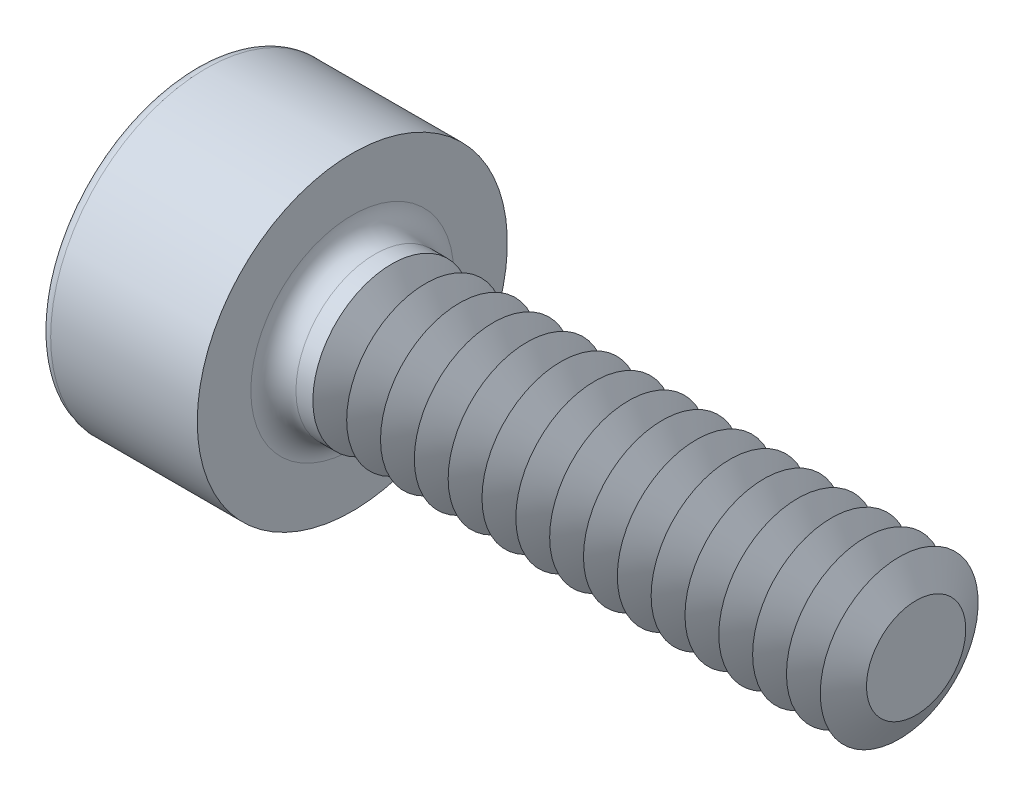
ISO-10303-21;
HEADER;
FILE_DESCRIPTION(('STEP AP214'),'2;1');
FILE_NAME('part.step','',(''),(''),'','','');
FILE_SCHEMA(('AUTOMOTIVE_DESIGN { 1 0 10303 214 1 1 1 1 }'));
ENDSEC;
DATA;
#1=APPLICATION_CONTEXT('core data for automotive mechanical design processes');
#2=APPLICATION_PROTOCOL_DEFINITION('international standard','automotive_design',2000,#1);
#3=PRODUCT_CONTEXT('',#1,'mechanical');
#4=PRODUCT('Part','Part','',(#3));
#5=PRODUCT_RELATED_PRODUCT_CATEGORY('part','',(#4));
#6=PRODUCT_DEFINITION_FORMATION('','',#4);
#7=PRODUCT_DEFINITION_CONTEXT('part definition',#1,'design');
#8=PRODUCT_DEFINITION('design','',#6,#7);
#9=PRODUCT_DEFINITION_SHAPE('','',#8);
#10=(LENGTH_UNIT() NAMED_UNIT(*) SI_UNIT(.MILLI.,.METRE.));
#11=(NAMED_UNIT(*) PLANE_ANGLE_UNIT() SI_UNIT($,.RADIAN.));
#12=(NAMED_UNIT(*) SI_UNIT($,.STERADIAN.) SOLID_ANGLE_UNIT());
#13=UNCERTAINTY_MEASURE_WITH_UNIT(LENGTH_MEASURE(1.E-05),#10,'distance_accuracy_value','');
#14=(GEOMETRIC_REPRESENTATION_CONTEXT(3) GLOBAL_UNCERTAINTY_ASSIGNED_CONTEXT((#13)) GLOBAL_UNIT_ASSIGNED_CONTEXT((#10,
#11,#12)) REPRESENTATION_CONTEXT('',''));
#15=CARTESIAN_POINT('',(0.,0.,0.));
#16=DIRECTION('',(0.,0.,1.));
#17=DIRECTION('',(1.,0.,0.));
#18=AXIS2_PLACEMENT_3D('',#15,#16,#17);
#19=CARTESIAN_POINT('',(5.35000440006454,0.,0.));
#20=DIRECTION('',(-1.,0.,0.));
#21=DIRECTION('',(0.,0.,1.));
#22=AXIS2_PLACEMENT_3D('',#19,#20,#21);
#23=CONICAL_SURFACE('',#22,0.7,1.04719755119659);
#24=CARTESIAN_POINT('',(5.5,0.,0.));
#25=DIRECTION('',(-1.,0.,0.));
#26=DIRECTION('',(0.,0.,1.));
#27=AXIS2_PLACEMENT_3D('',#24,#25,#26);
#28=CIRCLE('',#27,0.4402);
#29=CARTESIAN_POINT('',(5.5,0.,0.4402));
#30=VERTEX_POINT('',#29);
#31=EDGE_CURVE('E345',#30,#30,#28,.T.);
#32=ORIENTED_EDGE('',*,*,#31,.T.);
#33=EDGE_LOOP('',(#32));
#34=FACE_BOUND('',#33,.T.);
#35=CARTESIAN_POINT('',(5.34999559993547,0.,0.));
#36=DIRECTION('',(-1.,0.,0.));
#37=DIRECTION('',(0.,0.,1.));
#38=AXIS2_PLACEMENT_3D('',#35,#36,#37);
#39=CIRCLE('',#38,0.7);
#40=CARTESIAN_POINT('',(5.34999559993547,0.,0.7));
#41=VERTEX_POINT('',#40);
#42=EDGE_CURVE('E353',#41,#41,#39,.T.);
#43=ORIENTED_EDGE('',*,*,#42,.F.);
#44=EDGE_LOOP('',(#43));
#45=FACE_BOUND('',#44,.T.);
#46=ADVANCED_FACE('F41',(#34,#45),#23,.T.);
#47=CARTESIAN_POINT('',(5.5,0.,0.));
#48=DIRECTION('',(1.,0.,0.));
#49=DIRECTION('',(0.,0.,-1.));
#50=AXIS2_PLACEMENT_3D('',#47,#48,#49);
#51=CONICAL_SURFACE('',#50,0.4402,1.0471975511966);
#52=CARTESIAN_POINT('',(5.64999559993547,0.,0.));
#53=DIRECTION('',(-1.,0.,0.));
#54=DIRECTION('',(0.,0.,1.));
#55=AXIS2_PLACEMENT_3D('',#52,#53,#54);
#56=CIRCLE('',#55,0.7);
#57=CARTESIAN_POINT('',(5.64999559993547,0.,0.7));
#58=VERTEX_POINT('',#57);
#59=EDGE_CURVE('E347',#58,#58,#56,.T.);
#60=ORIENTED_EDGE('',*,*,#59,.T.);
#61=EDGE_LOOP('',(#60));
#62=FACE_BOUND('',#61,.T.);
#63=ORIENTED_EDGE('',*,*,#31,.F.);
#64=EDGE_LOOP('',(#63));
#65=FACE_BOUND('',#64,.T.);
#66=ADVANCED_FACE('F149',(#62,#65),#51,.T.);
#67=CARTESIAN_POINT('',(6.4,0.7,0.));
#68=DIRECTION('',(-1.,0.,0.));
#69=DIRECTION('',(0.,0.,1.));
#70=AXIS2_PLACEMENT_3D('',#67,#68,#69);
#71=PLANE('',#70);
#72=CARTESIAN_POINT('',(6.4,0.,0.));
#73=DIRECTION('',(-1.,0.,0.));
#74=DIRECTION('',(0.,0.,1.));
#75=AXIS2_PLACEMENT_3D('',#72,#73,#74);
#76=CIRCLE('',#75,0.4402);
#77=CARTESIAN_POINT('',(6.4,0.,0.4402));
#78=VERTEX_POINT('',#77);
#79=EDGE_CURVE('E274',#78,#78,#76,.T.);
#80=ORIENTED_EDGE('',*,*,#79,.F.);
#81=EDGE_LOOP('',(#80));
#82=FACE_BOUND('',#81,.T.);
#83=ADVANCED_FACE('F155',(#82),#71,.F.);
#84=CARTESIAN_POINT('',(6.25000440006454,0.,0.));
#85=DIRECTION('',(-1.,0.,0.));
#86=DIRECTION('',(0.,0.,1.));
#87=AXIS2_PLACEMENT_3D('',#84,#85,#86);
#88=CONICAL_SURFACE('',#87,0.7,1.04719755119659);
#89=ORIENTED_EDGE('',*,*,#79,.T.);
#90=EDGE_LOOP('',(#89));
#91=FACE_BOUND('',#90,.T.);
#92=CARTESIAN_POINT('',(6.24999559993547,0.,0.));
#93=DIRECTION('',(-1.,0.,0.));
#94=DIRECTION('',(0.,0.,1.));
#95=AXIS2_PLACEMENT_3D('',#92,#93,#94);
#96=CIRCLE('',#95,0.7);
#97=CARTESIAN_POINT('',(6.24999559993547,0.,0.7));
#98=VERTEX_POINT('',#97);
#99=EDGE_CURVE('E285',#98,#98,#96,.T.);
#100=ORIENTED_EDGE('',*,*,#99,.F.);
#101=EDGE_LOOP('',(#100));
#102=FACE_BOUND('',#101,.T.);
#103=ADVANCED_FACE('F175',(#91,#102),#88,.T.);
#104=CARTESIAN_POINT('',(6.1,0.,0.));
#105=DIRECTION('',(1.,0.,0.));
#106=DIRECTION('',(0.,0.,-1.));
#107=AXIS2_PLACEMENT_3D('',#104,#105,#106);
#108=CONICAL_SURFACE('',#107,0.4402,1.0471975511966);
#109=ORIENTED_EDGE('',*,*,#99,.T.);
#110=EDGE_LOOP('',(#109));
#111=FACE_BOUND('',#110,.T.);
#112=CARTESIAN_POINT('',(6.1,0.,0.));
#113=DIRECTION('',(-1.,0.,0.));
#114=DIRECTION('',(0.,0.,1.));
#115=AXIS2_PLACEMENT_3D('',#112,#113,#114);
#116=CIRCLE('',#115,0.4402);
#117=CARTESIAN_POINT('',(6.1,0.,0.4402));
#118=VERTEX_POINT('',#117);
#119=EDGE_CURVE('E278',#118,#118,#116,.T.);
#120=ORIENTED_EDGE('',*,*,#119,.F.);
#121=EDGE_LOOP('',(#120));
#122=FACE_BOUND('',#121,.T.);
#123=ADVANCED_FACE('F172',(#111,#122),#108,.T.);
#124=CARTESIAN_POINT('',(5.95000440006454,0.,0.));
#125=DIRECTION('',(-1.,0.,0.));
#126=DIRECTION('',(0.,0.,1.));
#127=AXIS2_PLACEMENT_3D('',#124,#125,#126);
#128=CONICAL_SURFACE('',#127,0.7,1.04719755119659);
#129=ORIENTED_EDGE('',*,*,#119,.T.);
#130=EDGE_LOOP('',(#129));
#131=FACE_BOUND('',#130,.T.);
#132=CARTESIAN_POINT('',(5.94999559993547,0.,0.));
#133=DIRECTION('',(-1.,0.,0.));
#134=DIRECTION('',(0.,0.,1.));
#135=AXIS2_PLACEMENT_3D('',#132,#133,#134);
#136=CIRCLE('',#135,0.7);
#137=CARTESIAN_POINT('',(5.94999559993547,0.,0.7));
#138=VERTEX_POINT('',#137);
#139=EDGE_CURVE('E342',#138,#138,#136,.T.);
#140=ORIENTED_EDGE('',*,*,#139,.F.);
#141=EDGE_LOOP('',(#140));
#142=FACE_BOUND('',#141,.T.);
#143=ADVANCED_FACE('F166',(#131,#142),#128,.T.);
#144=CARTESIAN_POINT('',(5.8,0.,0.));
#145=DIRECTION('',(1.,0.,0.));
#146=DIRECTION('',(0.,0.,-1.));
#147=AXIS2_PLACEMENT_3D('',#144,#145,#146);
#148=CONICAL_SURFACE('',#147,0.4402,1.0471975511966);
#149=ORIENTED_EDGE('',*,*,#139,.T.);
#150=EDGE_LOOP('',(#149));
#151=FACE_BOUND('',#150,.T.);
#152=CARTESIAN_POINT('',(5.8,0.,0.));
#153=DIRECTION('',(-1.,0.,0.));
#154=DIRECTION('',(0.,0.,1.));
#155=AXIS2_PLACEMENT_3D('',#152,#153,#154);
#156=CIRCLE('',#155,0.4402);
#157=CARTESIAN_POINT('',(5.8,0.,0.4402));
#158=VERTEX_POINT('',#157);
#159=EDGE_CURVE('E339',#158,#158,#156,.T.);
#160=ORIENTED_EDGE('',*,*,#159,.F.);
#161=EDGE_LOOP('',(#160));
#162=FACE_BOUND('',#161,.T.);
#163=ADVANCED_FACE('F162',(#151,#162),#148,.T.);
#164=CARTESIAN_POINT('',(5.65000440006454,0.,0.));
#165=DIRECTION('',(-1.,0.,0.));
#166=DIRECTION('',(0.,0.,1.));
#167=AXIS2_PLACEMENT_3D('',#164,#165,#166);
#168=CONICAL_SURFACE('',#167,0.7,1.04719755119659);
#169=ORIENTED_EDGE('',*,*,#159,.T.);
#170=EDGE_LOOP('',(#169));
#171=FACE_BOUND('',#170,.T.);
#172=ORIENTED_EDGE('',*,*,#59,.F.);
#173=EDGE_LOOP('',(#172));
#174=FACE_BOUND('',#173,.T.);
#175=ADVANCED_FACE('F165',(#171,#174),#168,.T.);
#176=CARTESIAN_POINT('',(5.05000440006454,0.,0.));
#177=DIRECTION('',(-1.,0.,0.));
#178=DIRECTION('',(0.,0.,1.));
#179=AXIS2_PLACEMENT_3D('',#176,#177,#178);
#180=CONICAL_SURFACE('',#179,0.7,1.04719755119659);
#181=CARTESIAN_POINT('',(5.2,0.,0.));
#182=DIRECTION('',(-1.,0.,0.));
#183=DIRECTION('',(0.,0.,1.));
#184=AXIS2_PLACEMENT_3D('',#181,#182,#183);
#185=CIRCLE('',#184,0.4402);
#186=CARTESIAN_POINT('',(5.2,0.,0.4402));
#187=VERTEX_POINT('',#186);
#188=EDGE_CURVE('E350',#187,#187,#185,.T.);
#189=ORIENTED_EDGE('',*,*,#188,.T.);
#190=EDGE_LOOP('',(#189));
#191=FACE_BOUND('',#190,.T.);
#192=CARTESIAN_POINT('',(5.04999559993547,0.,0.));
#193=DIRECTION('',(-1.,0.,0.));
#194=DIRECTION('',(0.,0.,1.));
#195=AXIS2_PLACEMENT_3D('',#192,#193,#194);
#196=CIRCLE('',#195,0.7);
#197=CARTESIAN_POINT('',(5.04999559993547,0.,0.7));
#198=VERTEX_POINT('',#197);
#199=EDGE_CURVE('E359',#198,#198,#196,.T.);
#200=ORIENTED_EDGE('',*,*,#199,.F.);
#201=EDGE_LOOP('',(#200));
#202=FACE_BOUND('',#201,.T.);
#203=ADVANCED_FACE('F170',(#191,#202),#180,.T.);
#204=CARTESIAN_POINT('',(5.2,0.,0.));
#205=DIRECTION('',(1.,0.,0.));
#206=DIRECTION('',(0.,0.,-1.));
#207=AXIS2_PLACEMENT_3D('',#204,#205,#206);
#208=CONICAL_SURFACE('',#207,0.4402,1.0471975511966);
#209=ORIENTED_EDGE('',*,*,#42,.T.);
#210=EDGE_LOOP('',(#209));
#211=FACE_BOUND('',#210,.T.);
#212=ORIENTED_EDGE('',*,*,#188,.F.);
#213=EDGE_LOOP('',(#212));
#214=FACE_BOUND('',#213,.T.);
#215=ADVANCED_FACE('F516',(#211,#214),#208,.T.);
#216=CARTESIAN_POINT('',(4.75000440006454,0.,0.));
#217=DIRECTION('',(-1.,0.,0.));
#218=DIRECTION('',(0.,0.,1.));
#219=AXIS2_PLACEMENT_3D('',#216,#217,#218);
#220=CONICAL_SURFACE('',#219,0.7,1.04719755119659);
#221=CARTESIAN_POINT('',(4.9,0.,0.));
#222=DIRECTION('',(-1.,0.,0.));
#223=DIRECTION('',(0.,0.,1.));
#224=AXIS2_PLACEMENT_3D('',#221,#222,#223);
#225=CIRCLE('',#224,0.4402);
#226=CARTESIAN_POINT('',(4.9,0.,0.4402));
#227=VERTEX_POINT('',#226);
#228=EDGE_CURVE('E356',#227,#227,#225,.T.);
#229=ORIENTED_EDGE('',*,*,#228,.T.);
#230=EDGE_LOOP('',(#229));
#231=FACE_BOUND('',#230,.T.);
#232=CARTESIAN_POINT('',(4.74999559993547,0.,0.));
#233=DIRECTION('',(-1.,0.,0.));
#234=DIRECTION('',(0.,0.,1.));
#235=AXIS2_PLACEMENT_3D('',#232,#233,#234);
#236=CIRCLE('',#235,0.7);
#237=CARTESIAN_POINT('',(4.74999559993547,0.,0.7));
#238=VERTEX_POINT('',#237);
#239=EDGE_CURVE('E365',#238,#238,#236,.T.);
#240=ORIENTED_EDGE('',*,*,#239,.F.);
#241=EDGE_LOOP('',(#240));
#242=FACE_BOUND('',#241,.T.);
#243=ADVANCED_FACE('F512',(#231,#242),#220,.T.);
#244=CARTESIAN_POINT('',(4.9,0.,0.));
#245=DIRECTION('',(1.,0.,0.));
#246=DIRECTION('',(0.,0.,-1.));
#247=AXIS2_PLACEMENT_3D('',#244,#245,#246);
#248=CONICAL_SURFACE('',#247,0.4402,1.0471975511966);
#249=ORIENTED_EDGE('',*,*,#199,.T.);
#250=EDGE_LOOP('',(#249));
#251=FACE_BOUND('',#250,.T.);
#252=ORIENTED_EDGE('',*,*,#228,.F.);
#253=EDGE_LOOP('',(#252));
#254=FACE_BOUND('',#253,.T.);
#255=ADVANCED_FACE('F508',(#251,#254),#248,.T.);
#256=CARTESIAN_POINT('',(4.45000440006454,0.,0.));
#257=DIRECTION('',(-1.,0.,0.));
#258=DIRECTION('',(0.,0.,1.));
#259=AXIS2_PLACEMENT_3D('',#256,#257,#258);
#260=CONICAL_SURFACE('',#259,0.7,1.04719755119659);
#261=CARTESIAN_POINT('',(4.6,0.,0.));
#262=DIRECTION('',(-1.,0.,0.));
#263=DIRECTION('',(0.,0.,1.));
#264=AXIS2_PLACEMENT_3D('',#261,#262,#263);
#265=CIRCLE('',#264,0.4402);
#266=CARTESIAN_POINT('',(4.6,0.,0.4402));
#267=VERTEX_POINT('',#266);
#268=EDGE_CURVE('E362',#267,#267,#265,.T.);
#269=ORIENTED_EDGE('',*,*,#268,.T.);
#270=EDGE_LOOP('',(#269));
#271=FACE_BOUND('',#270,.T.);
#272=CARTESIAN_POINT('',(4.44999559993547,0.,0.));
#273=DIRECTION('',(-1.,0.,0.));
#274=DIRECTION('',(0.,0.,1.));
#275=AXIS2_PLACEMENT_3D('',#272,#273,#274);
#276=CIRCLE('',#275,0.7);
#277=CARTESIAN_POINT('',(4.44999559993547,0.,0.7));
#278=VERTEX_POINT('',#277);
#279=EDGE_CURVE('E371',#278,#278,#276,.T.);
#280=ORIENTED_EDGE('',*,*,#279,.F.);
#281=EDGE_LOOP('',(#280));
#282=FACE_BOUND('',#281,.T.);
#283=ADVANCED_FACE('F504',(#271,#282),#260,.T.);
#284=CARTESIAN_POINT('',(4.6,0.,0.));
#285=DIRECTION('',(1.,0.,0.));
#286=DIRECTION('',(0.,0.,-1.));
#287=AXIS2_PLACEMENT_3D('',#284,#285,#286);
#288=CONICAL_SURFACE('',#287,0.4402,1.0471975511966);
#289=ORIENTED_EDGE('',*,*,#239,.T.);
#290=EDGE_LOOP('',(#289));
#291=FACE_BOUND('',#290,.T.);
#292=ORIENTED_EDGE('',*,*,#268,.F.);
#293=EDGE_LOOP('',(#292));
#294=FACE_BOUND('',#293,.T.);
#295=ADVANCED_FACE('F500',(#291,#294),#288,.T.);
#296=CARTESIAN_POINT('',(4.15000440006454,0.,0.));
#297=DIRECTION('',(-1.,0.,0.));
#298=DIRECTION('',(0.,0.,1.));
#299=AXIS2_PLACEMENT_3D('',#296,#297,#298);
#300=CONICAL_SURFACE('',#299,0.7,1.04719755119659);
#301=CARTESIAN_POINT('',(4.3,0.,0.));
#302=DIRECTION('',(-1.,0.,0.));
#303=DIRECTION('',(0.,0.,1.));
#304=AXIS2_PLACEMENT_3D('',#301,#302,#303);
#305=CIRCLE('',#304,0.4402);
#306=CARTESIAN_POINT('',(4.3,0.,0.4402));
#307=VERTEX_POINT('',#306);
#308=EDGE_CURVE('E368',#307,#307,#305,.T.);
#309=ORIENTED_EDGE('',*,*,#308,.T.);
#310=EDGE_LOOP('',(#309));
#311=FACE_BOUND('',#310,.T.);
#312=CARTESIAN_POINT('',(4.14999559993547,0.,0.));
#313=DIRECTION('',(-1.,0.,0.));
#314=DIRECTION('',(0.,0.,1.));
#315=AXIS2_PLACEMENT_3D('',#312,#313,#314);
#316=CIRCLE('',#315,0.7);
#317=CARTESIAN_POINT('',(4.14999559993547,0.,0.7));
#318=VERTEX_POINT('',#317);
#319=EDGE_CURVE('E377',#318,#318,#316,.T.);
#320=ORIENTED_EDGE('',*,*,#319,.F.);
#321=EDGE_LOOP('',(#320));
#322=FACE_BOUND('',#321,.T.);
#323=ADVANCED_FACE('F496',(#311,#322),#300,.T.);
#324=CARTESIAN_POINT('',(4.3,0.,0.));
#325=DIRECTION('',(1.,0.,0.));
#326=DIRECTION('',(0.,0.,-1.));
#327=AXIS2_PLACEMENT_3D('',#324,#325,#326);
#328=CONICAL_SURFACE('',#327,0.4402,1.0471975511966);
#329=ORIENTED_EDGE('',*,*,#279,.T.);
#330=EDGE_LOOP('',(#329));
#331=FACE_BOUND('',#330,.T.);
#332=ORIENTED_EDGE('',*,*,#308,.F.);
#333=EDGE_LOOP('',(#332));
#334=FACE_BOUND('',#333,.T.);
#335=ADVANCED_FACE('F492',(#331,#334),#328,.T.);
#336=CARTESIAN_POINT('',(3.85000440006454,0.,0.));
#337=DIRECTION('',(-1.,0.,0.));
#338=DIRECTION('',(0.,0.,1.));
#339=AXIS2_PLACEMENT_3D('',#336,#337,#338);
#340=CONICAL_SURFACE('',#339,0.7,1.04719755119659);
#341=CARTESIAN_POINT('',(4.,0.,0.));
#342=DIRECTION('',(-1.,0.,0.));
#343=DIRECTION('',(0.,0.,1.));
#344=AXIS2_PLACEMENT_3D('',#341,#342,#343);
#345=CIRCLE('',#344,0.4402);
#346=CARTESIAN_POINT('',(4.,0.,0.4402));
#347=VERTEX_POINT('',#346);
#348=EDGE_CURVE('E374',#347,#347,#345,.T.);
#349=ORIENTED_EDGE('',*,*,#348,.T.);
#350=EDGE_LOOP('',(#349));
#351=FACE_BOUND('',#350,.T.);
#352=CARTESIAN_POINT('',(3.84999559993547,0.,0.));
#353=DIRECTION('',(-1.,0.,0.));
#354=DIRECTION('',(0.,0.,1.));
#355=AXIS2_PLACEMENT_3D('',#352,#353,#354);
#356=CIRCLE('',#355,0.7);
#357=CARTESIAN_POINT('',(3.84999559993547,0.,0.7));
#358=VERTEX_POINT('',#357);
#359=EDGE_CURVE('E383',#358,#358,#356,.T.);
#360=ORIENTED_EDGE('',*,*,#359,.F.);
#361=EDGE_LOOP('',(#360));
#362=FACE_BOUND('',#361,.T.);
#363=ADVANCED_FACE('F488',(#351,#362),#340,.T.);
#364=CARTESIAN_POINT('',(4.,0.,0.));
#365=DIRECTION('',(1.,0.,0.));
#366=DIRECTION('',(0.,0.,-1.));
#367=AXIS2_PLACEMENT_3D('',#364,#365,#366);
#368=CONICAL_SURFACE('',#367,0.4402,1.0471975511966);
#369=ORIENTED_EDGE('',*,*,#319,.T.);
#370=EDGE_LOOP('',(#369));
#371=FACE_BOUND('',#370,.T.);
#372=ORIENTED_EDGE('',*,*,#348,.F.);
#373=EDGE_LOOP('',(#372));
#374=FACE_BOUND('',#373,.T.);
#375=ADVANCED_FACE('F484',(#371,#374),#368,.T.);
#376=CARTESIAN_POINT('',(3.55000440006454,0.,0.));
#377=DIRECTION('',(-1.,0.,0.));
#378=DIRECTION('',(0.,0.,1.));
#379=AXIS2_PLACEMENT_3D('',#376,#377,#378);
#380=CONICAL_SURFACE('',#379,0.7,1.04719755119659);
#381=CARTESIAN_POINT('',(3.7,0.,0.));
#382=DIRECTION('',(-1.,0.,0.));
#383=DIRECTION('',(0.,0.,1.));
#384=AXIS2_PLACEMENT_3D('',#381,#382,#383);
#385=CIRCLE('',#384,0.4402);
#386=CARTESIAN_POINT('',(3.7,0.,0.4402));
#387=VERTEX_POINT('',#386);
#388=EDGE_CURVE('E380',#387,#387,#385,.T.);
#389=ORIENTED_EDGE('',*,*,#388,.T.);
#390=EDGE_LOOP('',(#389));
#391=FACE_BOUND('',#390,.T.);
#392=CARTESIAN_POINT('',(3.54999559993547,0.,0.));
#393=DIRECTION('',(-1.,0.,0.));
#394=DIRECTION('',(0.,0.,1.));
#395=AXIS2_PLACEMENT_3D('',#392,#393,#394);
#396=CIRCLE('',#395,0.7);
#397=CARTESIAN_POINT('',(3.54999559993547,0.,0.7));
#398=VERTEX_POINT('',#397);
#399=EDGE_CURVE('E389',#398,#398,#396,.T.);
#400=ORIENTED_EDGE('',*,*,#399,.F.);
#401=EDGE_LOOP('',(#400));
#402=FACE_BOUND('',#401,.T.);
#403=ADVANCED_FACE('F480',(#391,#402),#380,.T.);
#404=CARTESIAN_POINT('',(3.7,0.,0.));
#405=DIRECTION('',(1.,0.,0.));
#406=DIRECTION('',(0.,0.,-1.));
#407=AXIS2_PLACEMENT_3D('',#404,#405,#406);
#408=CONICAL_SURFACE('',#407,0.4402,1.0471975511966);
#409=ORIENTED_EDGE('',*,*,#359,.T.);
#410=EDGE_LOOP('',(#409));
#411=FACE_BOUND('',#410,.T.);
#412=ORIENTED_EDGE('',*,*,#388,.F.);
#413=EDGE_LOOP('',(#412));
#414=FACE_BOUND('',#413,.T.);
#415=ADVANCED_FACE('F476',(#411,#414),#408,.T.);
#416=CARTESIAN_POINT('',(3.25000440006454,0.,0.));
#417=DIRECTION('',(-1.,0.,0.));
#418=DIRECTION('',(0.,0.,1.));
#419=AXIS2_PLACEMENT_3D('',#416,#417,#418);
#420=CONICAL_SURFACE('',#419,0.7,1.04719755119659);
#421=CARTESIAN_POINT('',(3.4,0.,0.));
#422=DIRECTION('',(-1.,0.,0.));
#423=DIRECTION('',(0.,0.,1.));
#424=AXIS2_PLACEMENT_3D('',#421,#422,#423);
#425=CIRCLE('',#424,0.4402);
#426=CARTESIAN_POINT('',(3.4,0.,0.4402));
#427=VERTEX_POINT('',#426);
#428=EDGE_CURVE('E386',#427,#427,#425,.T.);
#429=ORIENTED_EDGE('',*,*,#428,.T.);
#430=EDGE_LOOP('',(#429));
#431=FACE_BOUND('',#430,.T.);
#432=CARTESIAN_POINT('',(3.24999559993547,0.,0.));
#433=DIRECTION('',(-1.,0.,0.));
#434=DIRECTION('',(0.,0.,1.));
#435=AXIS2_PLACEMENT_3D('',#432,#433,#434);
#436=CIRCLE('',#435,0.7);
#437=CARTESIAN_POINT('',(3.24999559993547,0.,0.7));
#438=VERTEX_POINT('',#437);
#439=EDGE_CURVE('E395',#438,#438,#436,.T.);
#440=ORIENTED_EDGE('',*,*,#439,.F.);
#441=EDGE_LOOP('',(#440));
#442=FACE_BOUND('',#441,.T.);
#443=ADVANCED_FACE('F472',(#431,#442),#420,.T.);
#444=CARTESIAN_POINT('',(3.4,0.,0.));
#445=DIRECTION('',(1.,0.,0.));
#446=DIRECTION('',(0.,0.,-1.));
#447=AXIS2_PLACEMENT_3D('',#444,#445,#446);
#448=CONICAL_SURFACE('',#447,0.4402,1.0471975511966);
#449=ORIENTED_EDGE('',*,*,#399,.T.);
#450=EDGE_LOOP('',(#449));
#451=FACE_BOUND('',#450,.T.);
#452=ORIENTED_EDGE('',*,*,#428,.F.);
#453=EDGE_LOOP('',(#452));
#454=FACE_BOUND('',#453,.T.);
#455=ADVANCED_FACE('F468',(#451,#454),#448,.T.);
#456=CARTESIAN_POINT('',(2.95000440006454,0.,0.));
#457=DIRECTION('',(-1.,0.,0.));
#458=DIRECTION('',(0.,0.,1.));
#459=AXIS2_PLACEMENT_3D('',#456,#457,#458);
#460=CONICAL_SURFACE('',#459,0.7,1.04719755119659);
#461=CARTESIAN_POINT('',(3.1,0.,0.));
#462=DIRECTION('',(-1.,0.,0.));
#463=DIRECTION('',(0.,0.,1.));
#464=AXIS2_PLACEMENT_3D('',#461,#462,#463);
#465=CIRCLE('',#464,0.4402);
#466=CARTESIAN_POINT('',(3.1,0.,0.4402));
#467=VERTEX_POINT('',#466);
#468=EDGE_CURVE('E392',#467,#467,#465,.T.);
#469=ORIENTED_EDGE('',*,*,#468,.T.);
#470=EDGE_LOOP('',(#469));
#471=FACE_BOUND('',#470,.T.);
#472=CARTESIAN_POINT('',(2.94999559993547,0.,0.));
#473=DIRECTION('',(-1.,0.,0.));
#474=DIRECTION('',(0.,0.,1.));
#475=AXIS2_PLACEMENT_3D('',#472,#473,#474);
#476=CIRCLE('',#475,0.7);
#477=CARTESIAN_POINT('',(2.94999559993547,0.,0.7));
#478=VERTEX_POINT('',#477);
#479=EDGE_CURVE('E401',#478,#478,#476,.T.);
#480=ORIENTED_EDGE('',*,*,#479,.F.);
#481=EDGE_LOOP('',(#480));
#482=FACE_BOUND('',#481,.T.);
#483=ADVANCED_FACE('F464',(#471,#482),#460,.T.);
#484=CARTESIAN_POINT('',(3.1,0.,0.));
#485=DIRECTION('',(1.,0.,0.));
#486=DIRECTION('',(0.,0.,-1.));
#487=AXIS2_PLACEMENT_3D('',#484,#485,#486);
#488=CONICAL_SURFACE('',#487,0.4402,1.0471975511966);
#489=ORIENTED_EDGE('',*,*,#439,.T.);
#490=EDGE_LOOP('',(#489));
#491=FACE_BOUND('',#490,.T.);
#492=ORIENTED_EDGE('',*,*,#468,.F.);
#493=EDGE_LOOP('',(#492));
#494=FACE_BOUND('',#493,.T.);
#495=ADVANCED_FACE('F460',(#491,#494),#488,.T.);
#496=CARTESIAN_POINT('',(2.65000440006454,0.,0.));
#497=DIRECTION('',(-1.,0.,0.));
#498=DIRECTION('',(0.,0.,1.));
#499=AXIS2_PLACEMENT_3D('',#496,#497,#498);
#500=CONICAL_SURFACE('',#499,0.7,1.04719755119659);
#501=CARTESIAN_POINT('',(2.8,0.,0.));
#502=DIRECTION('',(-1.,0.,0.));
#503=DIRECTION('',(0.,0.,1.));
#504=AXIS2_PLACEMENT_3D('',#501,#502,#503);
#505=CIRCLE('',#504,0.4402);
#506=CARTESIAN_POINT('',(2.8,0.,0.4402));
#507=VERTEX_POINT('',#506);
#508=EDGE_CURVE('E398',#507,#507,#505,.T.);
#509=ORIENTED_EDGE('',*,*,#508,.T.);
#510=EDGE_LOOP('',(#509));
#511=FACE_BOUND('',#510,.T.);
#512=CARTESIAN_POINT('',(2.64999559993547,0.,0.));
#513=DIRECTION('',(-1.,0.,0.));
#514=DIRECTION('',(0.,0.,1.));
#515=AXIS2_PLACEMENT_3D('',#512,#513,#514);
#516=CIRCLE('',#515,0.7);
#517=CARTESIAN_POINT('',(2.64999559993547,0.,0.7));
#518=VERTEX_POINT('',#517);
#519=EDGE_CURVE('E407',#518,#518,#516,.T.);
#520=ORIENTED_EDGE('',*,*,#519,.F.);
#521=EDGE_LOOP('',(#520));
#522=FACE_BOUND('',#521,.T.);
#523=ADVANCED_FACE('F456',(#511,#522),#500,.T.);
#524=CARTESIAN_POINT('',(2.8,0.,0.));
#525=DIRECTION('',(1.,0.,0.));
#526=DIRECTION('',(0.,0.,-1.));
#527=AXIS2_PLACEMENT_3D('',#524,#525,#526);
#528=CONICAL_SURFACE('',#527,0.4402,1.0471975511966);
#529=ORIENTED_EDGE('',*,*,#479,.T.);
#530=EDGE_LOOP('',(#529));
#531=FACE_BOUND('',#530,.T.);
#532=ORIENTED_EDGE('',*,*,#508,.F.);
#533=EDGE_LOOP('',(#532));
#534=FACE_BOUND('',#533,.T.);
#535=ADVANCED_FACE('F452',(#531,#534),#528,.T.);
#536=CARTESIAN_POINT('',(2.35000440006454,0.,0.));
#537=DIRECTION('',(-1.,0.,0.));
#538=DIRECTION('',(0.,0.,1.));
#539=AXIS2_PLACEMENT_3D('',#536,#537,#538);
#540=CONICAL_SURFACE('',#539,0.7,1.04719755119659);
#541=CARTESIAN_POINT('',(2.5,0.,0.));
#542=DIRECTION('',(-1.,0.,0.));
#543=DIRECTION('',(0.,0.,1.));
#544=AXIS2_PLACEMENT_3D('',#541,#542,#543);
#545=CIRCLE('',#544,0.4402);
#546=CARTESIAN_POINT('',(2.5,0.,0.4402));
#547=VERTEX_POINT('',#546);
#548=EDGE_CURVE('E404',#547,#547,#545,.T.);
#549=ORIENTED_EDGE('',*,*,#548,.T.);
#550=EDGE_LOOP('',(#549));
#551=FACE_BOUND('',#550,.T.);
#552=CARTESIAN_POINT('',(2.34999559993547,0.,0.));
#553=DIRECTION('',(-1.,0.,0.));
#554=DIRECTION('',(0.,0.,1.));
#555=AXIS2_PLACEMENT_3D('',#552,#553,#554);
#556=CIRCLE('',#555,0.7);
#557=CARTESIAN_POINT('',(2.34999559993547,0.,0.7));
#558=VERTEX_POINT('',#557);
#559=EDGE_CURVE('E413',#558,#558,#556,.T.);
#560=ORIENTED_EDGE('',*,*,#559,.F.);
#561=EDGE_LOOP('',(#560));
#562=FACE_BOUND('',#561,.T.);
#563=ADVANCED_FACE('F448',(#551,#562),#540,.T.);
#564=CARTESIAN_POINT('',(2.5,0.,0.));
#565=DIRECTION('',(1.,0.,0.));
#566=DIRECTION('',(0.,0.,-1.));
#567=AXIS2_PLACEMENT_3D('',#564,#565,#566);
#568=CONICAL_SURFACE('',#567,0.4402,1.0471975511966);
#569=ORIENTED_EDGE('',*,*,#519,.T.);
#570=EDGE_LOOP('',(#569));
#571=FACE_BOUND('',#570,.T.);
#572=ORIENTED_EDGE('',*,*,#548,.F.);
#573=EDGE_LOOP('',(#572));
#574=FACE_BOUND('',#573,.T.);
#575=ADVANCED_FACE('F444',(#571,#574),#568,.T.);
#576=CARTESIAN_POINT('',(2.05000440006454,0.,0.));
#577=DIRECTION('',(-1.,0.,0.));
#578=DIRECTION('',(0.,0.,1.));
#579=AXIS2_PLACEMENT_3D('',#576,#577,#578);
#580=CONICAL_SURFACE('',#579,0.7,1.04719755119659);
#581=CARTESIAN_POINT('',(2.2,0.,0.));
#582=DIRECTION('',(-1.,0.,0.));
#583=DIRECTION('',(0.,0.,1.));
#584=AXIS2_PLACEMENT_3D('',#581,#582,#583);
#585=CIRCLE('',#584,0.4402);
#586=CARTESIAN_POINT('',(2.2,0.,0.4402));
#587=VERTEX_POINT('',#586);
#588=EDGE_CURVE('E410',#587,#587,#585,.T.);
#589=ORIENTED_EDGE('',*,*,#588,.T.);
#590=EDGE_LOOP('',(#589));
#591=FACE_BOUND('',#590,.T.);
#592=CARTESIAN_POINT('',(2.04999559993547,0.,0.));
#593=DIRECTION('',(-1.,0.,0.));
#594=DIRECTION('',(0.,0.,1.));
#595=AXIS2_PLACEMENT_3D('',#592,#593,#594);
#596=CIRCLE('',#595,0.7);
#597=CARTESIAN_POINT('',(2.04999559993547,0.,0.7));
#598=VERTEX_POINT('',#597);
#599=EDGE_CURVE('E419',#598,#598,#596,.T.);
#600=ORIENTED_EDGE('',*,*,#599,.F.);
#601=EDGE_LOOP('',(#600));
#602=FACE_BOUND('',#601,.T.);
#603=ADVANCED_FACE('F438',(#591,#602),#580,.T.);
#604=CARTESIAN_POINT('',(2.2,0.,0.));
#605=DIRECTION('',(1.,0.,0.));
#606=DIRECTION('',(0.,0.,-1.));
#607=AXIS2_PLACEMENT_3D('',#604,#605,#606);
#608=CONICAL_SURFACE('',#607,0.4402,1.0471975511966);
#609=ORIENTED_EDGE('',*,*,#559,.T.);
#610=EDGE_LOOP('',(#609));
#611=FACE_BOUND('',#610,.T.);
#612=ORIENTED_EDGE('',*,*,#588,.F.);
#613=EDGE_LOOP('',(#612));
#614=FACE_BOUND('',#613,.T.);
#615=ADVANCED_FACE('F429',(#611,#614),#608,.T.);
#616=CARTESIAN_POINT('',(1.75000440006454,0.,0.));
#617=DIRECTION('',(-1.,0.,0.));
#618=DIRECTION('',(0.,0.,1.));
#619=AXIS2_PLACEMENT_3D('',#616,#617,#618);
#620=CONICAL_SURFACE('',#619,0.7,1.04719755119659);
#621=CARTESIAN_POINT('',(1.9,0.,0.));
#622=DIRECTION('',(-1.,0.,0.));
#623=DIRECTION('',(0.,0.,1.));
#624=AXIS2_PLACEMENT_3D('',#621,#622,#623);
#625=CIRCLE('',#624,0.4402);
#626=CARTESIAN_POINT('',(1.9,0.,0.4402));
#627=VERTEX_POINT('',#626);
#628=EDGE_CURVE('E416',#627,#627,#625,.T.);
#629=ORIENTED_EDGE('',*,*,#628,.T.);
#630=EDGE_LOOP('',(#629));
#631=FACE_BOUND('',#630,.T.);
#632=CARTESIAN_POINT('',(1.75000440006454,0.,0.));
#633=DIRECTION('',(-1.,0.,0.));
#634=DIRECTION('',(0.,0.,1.));
#635=AXIS2_PLACEMENT_3D('',#632,#633,#634);
#636=CIRCLE('',#635,0.7);
#637=CARTESIAN_POINT('',(1.75000440006454,0.,0.7));
#638=VERTEX_POINT('',#637);
#639=EDGE_CURVE('E422',#638,#638,#636,.T.);
#640=ORIENTED_EDGE('',*,*,#639,.F.);
#641=EDGE_LOOP('',(#640));
#642=FACE_BOUND('',#641,.T.);
#643=ADVANCED_FACE('F427',(#631,#642),#620,.T.);
#644=CARTESIAN_POINT('',(1.9,0.,0.));
#645=DIRECTION('',(1.,0.,0.));
#646=DIRECTION('',(0.,0.,-1.));
#647=AXIS2_PLACEMENT_3D('',#644,#645,#646);
#648=CONICAL_SURFACE('',#647,0.4402,1.0471975511966);
#649=ORIENTED_EDGE('',*,*,#599,.T.);
#650=EDGE_LOOP('',(#649));
#651=FACE_BOUND('',#650,.T.);
#652=ORIENTED_EDGE('',*,*,#628,.F.);
#653=EDGE_LOOP('',(#652));
#654=FACE_BOUND('',#653,.T.);
#655=ADVANCED_FACE('F198',(#651,#654),#648,.T.);
#656=CARTESIAN_POINT('',(0.7,0.749111974273539,-0.4325));
#657=DIRECTION('',(-0.898067507594914,-0.439857649475667,0.));
#658=DIRECTION('',(0.439857649475667,-0.898067507594914,0.));
#659=AXIS2_PLACEMENT_3D('',#656,#657,#658);
#660=PLANE('',#659);
#661=DIRECTION('',(-0.39048865355203,0.797269689995388,-0.460303870135567));
#662=VECTOR('',#661,1.);
#663=CARTESIAN_POINT('',(1.06690185249043,0.,0.));
#664=LINE('',#663,#662);
#665=CARTESIAN_POINT('',(1.06690185249043,0.,0.));
#666=VERTEX_POINT('',#665);
#667=CARTESIAN_POINT('',(0.7,0.749111974273539,-0.4325));
#668=VERTEX_POINT('',#667);
#669=EDGE_CURVE('E293',#666,#668,#664,.T.);
#670=ORIENTED_EDGE('',*,*,#669,.F.);
#671=DIRECTION('',(-0.39048865355203,0.797269689995388,0.460303870135567));
#672=VECTOR('',#671,1.);
#673=CARTESIAN_POINT('',(1.06690185249043,0.,0.));
#674=LINE('',#673,#672);
#675=CARTESIAN_POINT('',(0.7,0.749111974273539,0.4325));
#676=VERTEX_POINT('',#675);
#677=EDGE_CURVE('E282',#666,#676,#674,.T.);
#678=ORIENTED_EDGE('',*,*,#677,.T.);
#679=DIRECTION('',(0.,0.,-1.));
#680=VECTOR('',#679,1.);
#681=CARTESIAN_POINT('',(0.7,0.749111974273539,0.4325));
#682=LINE('',#681,#680);
#683=EDGE_CURVE('E303',#676,#668,#682,.T.);
#684=ORIENTED_EDGE('',*,*,#683,.T.);
#685=EDGE_LOOP('',(#670,#678,#684));
#686=FACE_BOUND('',#685,.T.);
#687=ADVANCED_FACE('F191',(#686),#660,.T.);
#688=CARTESIAN_POINT('',(0.7,0.,-0.865));
#689=DIRECTION('',(-0.898067507594914,-0.219928824737834,0.380927898494839));
#690=DIRECTION('',(0.39048865355203,0.,0.920607740271133));
#691=AXIS2_PLACEMENT_3D('',#688,#689,#690);
#692=PLANE('',#691);
#693=DIRECTION('',(-0.39048865355203,0.,-0.920607740271133));
#694=VECTOR('',#693,1.);
#695=CARTESIAN_POINT('',(1.06690185249043,0.,0.));
#696=LINE('',#695,#694);
#697=CARTESIAN_POINT('',(0.7,0.,-0.865));
#698=VERTEX_POINT('',#697);
#699=EDGE_CURVE('E289',#666,#698,#696,.T.);
#700=ORIENTED_EDGE('',*,*,#699,.F.);
#701=ORIENTED_EDGE('',*,*,#669,.T.);
#702=DIRECTION('',(0.,-0.866025403784439,-0.5));
#703=VECTOR('',#702,1.);
#704=CARTESIAN_POINT('',(0.7,0.749111974273539,-0.4325));
#705=LINE('',#704,#703);
#706=EDGE_CURVE('E306',#668,#698,#705,.T.);
#707=ORIENTED_EDGE('',*,*,#706,.T.);
#708=EDGE_LOOP('',(#700,#701,#707));
#709=FACE_BOUND('',#708,.T.);
#710=ADVANCED_FACE('F187',(#709),#692,.T.);
#711=CARTESIAN_POINT('',(0.7,-0.749111974273539,-0.4325));
#712=DIRECTION('',(-0.898067507594914,0.219928824737834,0.380927898494839));
#713=DIRECTION('',(0.39048865355203,0.,0.920607740271133));
#714=AXIS2_PLACEMENT_3D('',#711,#712,#713);
#715=PLANE('',#714);
#716=DIRECTION('',(-0.39048865355203,-0.797269689995388,-0.460303870135567));
#717=VECTOR('',#716,1.);
#718=CARTESIAN_POINT('',(1.06690185249043,0.,0.));
#719=LINE('',#718,#717);
#720=CARTESIAN_POINT('',(0.7,-0.749111974273539,-0.4325));
#721=VERTEX_POINT('',#720);
#722=EDGE_CURVE('E65',#666,#721,#719,.T.);
#723=ORIENTED_EDGE('',*,*,#722,.F.);
#724=ORIENTED_EDGE('',*,*,#699,.T.);
#725=DIRECTION('',(0.,-0.866025403784439,0.5));
#726=VECTOR('',#725,1.);
#727=CARTESIAN_POINT('',(0.7,0.,-0.865));
#728=LINE('',#727,#726);
#729=EDGE_CURVE('E309',#698,#721,#728,.T.);
#730=ORIENTED_EDGE('',*,*,#729,.T.);
#731=EDGE_LOOP('',(#723,#724,#730));
#732=FACE_BOUND('',#731,.T.);
#733=ADVANCED_FACE('F183',(#732),#715,.T.);
#734=CARTESIAN_POINT('',(0.7,-0.749111974273539,0.4325));
#735=DIRECTION('',(-0.898067507594914,0.439857649475667,0.));
#736=DIRECTION('',(-0.439857649475667,-0.898067507594914,0.));
#737=AXIS2_PLACEMENT_3D('',#734,#735,#736);
#738=PLANE('',#737);
#739=DIRECTION('',(-0.39048865355203,-0.797269689995388,0.460303870135567));
#740=VECTOR('',#739,1.);
#741=CARTESIAN_POINT('',(1.06690185249043,0.,0.));
#742=LINE('',#741,#740);
#743=CARTESIAN_POINT('',(0.7,-0.749111974273539,0.4325));
#744=VERTEX_POINT('',#743);
#745=EDGE_CURVE('E296',#666,#744,#742,.T.);
#746=ORIENTED_EDGE('',*,*,#745,.F.);
#747=ORIENTED_EDGE('',*,*,#722,.T.);
#748=DIRECTION('',(0.,0.,1.));
#749=VECTOR('',#748,1.);
#750=CARTESIAN_POINT('',(0.7,-0.749111974273539,-0.4325));
#751=LINE('',#750,#749);
#752=EDGE_CURVE('E93',#721,#744,#751,.T.);
#753=ORIENTED_EDGE('',*,*,#752,.T.);
#754=EDGE_LOOP('',(#746,#747,#753));
#755=FACE_BOUND('',#754,.T.);
#756=ADVANCED_FACE('F186',(#755),#738,.T.);
#757=CARTESIAN_POINT('',(0.7,0.,0.865));
#758=DIRECTION('',(-0.898067507594914,0.219928824737834,-0.380927898494839));
#759=DIRECTION('',(-0.39048865355203,0.,0.920607740271134));
#760=AXIS2_PLACEMENT_3D('',#757,#758,#759);
#761=PLANE('',#760);
#762=DIRECTION('',(-0.39048865355203,0.,0.920607740271133));
#763=VECTOR('',#762,1.);
#764=CARTESIAN_POINT('',(1.06690185249043,0.,0.));
#765=LINE('',#764,#763);
#766=CARTESIAN_POINT('',(0.7,0.,0.865));
#767=VERTEX_POINT('',#766);
#768=EDGE_CURVE('E277',#666,#767,#765,.T.);
#769=ORIENTED_EDGE('',*,*,#768,.F.);
#770=ORIENTED_EDGE('',*,*,#745,.T.);
#771=DIRECTION('',(0.,0.866025403784439,0.5));
#772=VECTOR('',#771,1.);
#773=CARTESIAN_POINT('',(0.7,-0.749111974273539,0.4325));
#774=LINE('',#773,#772);
#775=EDGE_CURVE('E110',#744,#767,#774,.T.);
#776=ORIENTED_EDGE('',*,*,#775,.T.);
#777=EDGE_LOOP('',(#769,#770,#776));
#778=FACE_BOUND('',#777,.T.);
#779=ADVANCED_FACE('F195',(#778),#761,.T.);
#780=CARTESIAN_POINT('',(0.7,0.749111974273539,0.4325));
#781=DIRECTION('',(-0.898067507594914,-0.219928824737834,-0.380927898494839));
#782=DIRECTION('',(-0.39048865355203,0.,0.920607740271133));
#783=AXIS2_PLACEMENT_3D('',#780,#781,#782);
#784=PLANE('',#783);
#785=ORIENTED_EDGE('',*,*,#677,.F.);
#786=ORIENTED_EDGE('',*,*,#768,.T.);
#787=DIRECTION('',(0.,0.866025403784439,-0.5));
#788=VECTOR('',#787,1.);
#789=CARTESIAN_POINT('',(0.7,0.,0.865));
#790=LINE('',#789,#788);
#791=EDGE_CURVE('E113',#767,#676,#790,.T.);
#792=ORIENTED_EDGE('',*,*,#791,.T.);
#793=EDGE_LOOP('',(#785,#786,#792));
#794=FACE_BOUND('',#793,.T.);
#795=ADVANCED_FACE('F202',(#794),#784,.T.);
#796=CARTESIAN_POINT('',(0.7,0.749111974273539,0.4325));
#797=DIRECTION('',(0.,1.,0.));
#798=DIRECTION('',(0.,0.,1.));
#799=AXIS2_PLACEMENT_3D('',#796,#797,#798);
#800=PLANE('',#799);
#801=DIRECTION('',(0.,0.,-1.));
#802=VECTOR('',#801,1.);
#803=CARTESIAN_POINT('',(0.,0.749111974273539,0.4325));
#804=LINE('',#803,#802);
#805=CARTESIAN_POINT('',(0.,0.749111974273539,0.4325));
#806=VERTEX_POINT('',#805);
#807=CARTESIAN_POINT('',(0.,0.749111974273539,-0.4325));
#808=VERTEX_POINT('',#807);
#809=EDGE_CURVE('E316',#806,#808,#804,.T.);
#810=ORIENTED_EDGE('',*,*,#809,.T.);
#811=DIRECTION('',(-1.,0.,0.));
#812=VECTOR('',#811,1.);
#813=CARTESIAN_POINT('',(0.7,0.749111974273539,-0.4325));
#814=LINE('',#813,#812);
#815=EDGE_CURVE('E120',#668,#808,#814,.T.);
#816=ORIENTED_EDGE('',*,*,#815,.F.);
#817=ORIENTED_EDGE('',*,*,#683,.F.);
#818=DIRECTION('',(-1.,0.,0.));
#819=VECTOR('',#818,1.);
#820=CARTESIAN_POINT('',(0.7,0.749111974273539,0.4325));
#821=LINE('',#820,#819);
#822=EDGE_CURVE('E122',#676,#806,#821,.T.);
#823=ORIENTED_EDGE('',*,*,#822,.T.);
#824=EDGE_LOOP('',(#810,#816,#817,#823));
#825=FACE_BOUND('',#824,.T.);
#826=ADVANCED_FACE('F206',(#825),#800,.F.);
#827=CARTESIAN_POINT('',(0.7,0.749111974273539,-0.4325));
#828=DIRECTION('',(0.,0.5,-0.866025403784439));
#829=DIRECTION('',(0.,0.866025403784439,0.5));
#830=AXIS2_PLACEMENT_3D('',#827,#828,#829);
#831=PLANE('',#830);
#832=DIRECTION('',(0.,-0.866025403784439,-0.5));
#833=VECTOR('',#832,1.);
#834=CARTESIAN_POINT('',(0.,0.749111974273539,-0.4325));
#835=LINE('',#834,#833);
#836=CARTESIAN_POINT('',(0.,0.,-0.865));
#837=VERTEX_POINT('',#836);
#838=EDGE_CURVE('E106',#808,#837,#835,.T.);
#839=ORIENTED_EDGE('',*,*,#838,.T.);
#840=DIRECTION('',(-1.,0.,0.));
#841=VECTOR('',#840,1.);
#842=CARTESIAN_POINT('',(0.7,0.,-0.865));
#843=LINE('',#842,#841);
#844=EDGE_CURVE('E97',#698,#837,#843,.T.);
#845=ORIENTED_EDGE('',*,*,#844,.F.);
#846=ORIENTED_EDGE('',*,*,#706,.F.);
#847=ORIENTED_EDGE('',*,*,#815,.T.);
#848=EDGE_LOOP('',(#839,#845,#846,#847));
#849=FACE_BOUND('',#848,.T.);
#850=ADVANCED_FACE('F213',(#849),#831,.F.);
#851=CARTESIAN_POINT('',(0.7,0.,-0.865));
#852=DIRECTION('',(0.,-0.5,-0.866025403784439));
#853=DIRECTION('',(0.,0.866025403784439,-0.5));
#854=AXIS2_PLACEMENT_3D('',#851,#852,#853);
#855=PLANE('',#854);
#856=DIRECTION('',(0.,-0.866025403784439,0.5));
#857=VECTOR('',#856,1.);
#858=CARTESIAN_POINT('',(0.,0.,-0.865));
#859=LINE('',#858,#857);
#860=CARTESIAN_POINT('',(0.,-0.749111974273539,-0.4325));
#861=VERTEX_POINT('',#860);
#862=EDGE_CURVE('E100',#837,#861,#859,.T.);
#863=ORIENTED_EDGE('',*,*,#862,.T.);
#864=DIRECTION('',(-1.,0.,0.));
#865=VECTOR('',#864,1.);
#866=CARTESIAN_POINT('',(0.7,-0.749111974273539,-0.4325));
#867=LINE('',#866,#865);
#868=EDGE_CURVE('E87',#721,#861,#867,.T.);
#869=ORIENTED_EDGE('',*,*,#868,.F.);
#870=ORIENTED_EDGE('',*,*,#729,.F.);
#871=ORIENTED_EDGE('',*,*,#844,.T.);
#872=EDGE_LOOP('',(#863,#869,#870,#871));
#873=FACE_BOUND('',#872,.T.);
#874=ADVANCED_FACE('F101',(#873),#855,.F.);
#875=CARTESIAN_POINT('',(0.7,-0.749111974273539,-0.4325));
#876=DIRECTION('',(0.,-1.,0.));
#877=DIRECTION('',(0.,0.,-1.));
#878=AXIS2_PLACEMENT_3D('',#875,#876,#877);
#879=PLANE('',#878);
#880=DIRECTION('',(0.,0.,1.));
#881=VECTOR('',#880,1.);
#882=CARTESIAN_POINT('',(0.,-0.749111974273539,-0.4325));
#883=LINE('',#882,#881);
#884=CARTESIAN_POINT('',(0.,-0.749111974273539,0.4325));
#885=VERTEX_POINT('',#884);
#886=EDGE_CURVE('E92',#861,#885,#883,.T.);
#887=ORIENTED_EDGE('',*,*,#886,.T.);
#888=DIRECTION('',(-1.,0.,0.));
#889=VECTOR('',#888,1.);
#890=CARTESIAN_POINT('',(0.7,-0.749111974273539,0.4325));
#891=LINE('',#890,#889);
#892=EDGE_CURVE('E96',#744,#885,#891,.T.);
#893=ORIENTED_EDGE('',*,*,#892,.F.);
#894=ORIENTED_EDGE('',*,*,#752,.F.);
#895=ORIENTED_EDGE('',*,*,#868,.T.);
#896=EDGE_LOOP('',(#887,#893,#894,#895));
#897=FACE_BOUND('',#896,.T.);
#898=ADVANCED_FACE('F89',(#897),#879,.F.);
#899=CARTESIAN_POINT('',(0.7,-0.749111974273539,0.4325));
#900=DIRECTION('',(0.,-0.5,0.866025403784439));
#901=DIRECTION('',(0.,-0.866025403784439,-0.5));
#902=AXIS2_PLACEMENT_3D('',#899,#900,#901);
#903=PLANE('',#902);
#904=DIRECTION('',(0.,0.866025403784439,0.5));
#905=VECTOR('',#904,1.);
#906=CARTESIAN_POINT('',(0.,-0.749111974273539,0.4325));
#907=LINE('',#906,#905);
#908=CARTESIAN_POINT('',(0.,0.,0.865));
#909=VERTEX_POINT('',#908);
#910=EDGE_CURVE('E56',#885,#909,#907,.T.);
#911=ORIENTED_EDGE('',*,*,#910,.T.);
#912=DIRECTION('',(-1.,0.,0.));
#913=VECTOR('',#912,1.);
#914=CARTESIAN_POINT('',(0.7,0.,0.865));
#915=LINE('',#914,#913);
#916=EDGE_CURVE('E124',#767,#909,#915,.T.);
#917=ORIENTED_EDGE('',*,*,#916,.F.);
#918=ORIENTED_EDGE('',*,*,#775,.F.);
#919=ORIENTED_EDGE('',*,*,#892,.T.);
#920=EDGE_LOOP('',(#911,#917,#918,#919));
#921=FACE_BOUND('',#920,.T.);
#922=ADVANCED_FACE('F210',(#921),#903,.F.);
#923=CARTESIAN_POINT('',(0.7,0.,0.865));
#924=DIRECTION('',(0.,0.5,0.866025403784439));
#925=DIRECTION('',(0.,-0.866025403784439,0.5));
#926=AXIS2_PLACEMENT_3D('',#923,#924,#925);
#927=PLANE('',#926);
#928=DIRECTION('',(0.,0.866025403784439,-0.5));
#929=VECTOR('',#928,1.);
#930=CARTESIAN_POINT('',(0.,0.,0.865));
#931=LINE('',#930,#929);
#932=EDGE_CURVE('E313',#909,#806,#931,.T.);
#933=ORIENTED_EDGE('',*,*,#932,.T.);
#934=ORIENTED_EDGE('',*,*,#822,.F.);
#935=ORIENTED_EDGE('',*,*,#791,.F.);
#936=ORIENTED_EDGE('',*,*,#916,.T.);
#937=EDGE_LOOP('',(#933,#934,#935,#936));
#938=FACE_BOUND('',#937,.T.);
#939=ADVANCED_FACE('F220',(#938),#927,.F.);
#940=CARTESIAN_POINT('',(0.,0.,0.));
#941=DIRECTION('',(1.,0.,0.));
#942=DIRECTION('',(0.,0.,-1.));
#943=AXIS2_PLACEMENT_3D('',#940,#941,#942);
#944=PLANE('',#943);
#945=CARTESIAN_POINT('',(0.,0.,0.));
#946=DIRECTION('',(1.,0.,0.));
#947=DIRECTION('',(0.,0.,-1.));
#948=AXIS2_PLACEMENT_3D('',#945,#946,#947);
#949=CIRCLE('',#948,1.275);
#950=CARTESIAN_POINT('',(0.,0.,-1.275));
#951=VERTEX_POINT('',#950);
#952=EDGE_CURVE('E49',#951,#951,#949,.F.);
#953=ORIENTED_EDGE('',*,*,#952,.T.);
#954=EDGE_LOOP('',(#953));
#955=FACE_BOUND('',#954,.T.);
#956=ORIENTED_EDGE('',*,*,#932,.F.);
#957=ORIENTED_EDGE('',*,*,#910,.F.);
#958=ORIENTED_EDGE('',*,*,#886,.F.);
#959=ORIENTED_EDGE('',*,*,#862,.F.);
#960=ORIENTED_EDGE('',*,*,#838,.F.);
#961=ORIENTED_EDGE('',*,*,#809,.F.);
#962=EDGE_LOOP('',(#956,#957,#958,#959,#960,#961));
#963=FACE_BOUND('',#962,.T.);
#964=ADVANCED_FACE('F109',(#955,#963),#944,.F.);
#965=CARTESIAN_POINT('',(0.,0.,0.));
#966=DIRECTION('',(-1.,0.,0.));
#967=DIRECTION('',(0.,0.,1.));
#968=AXIS2_PLACEMENT_3D('',#965,#966,#967);
#969=CYLINDRICAL_SURFACE('',#968,1.375);
#970=CARTESIAN_POINT('',(0.1,0.,0.));
#971=DIRECTION('',(1.,0.,0.));
#972=DIRECTION('',(0.,0.,-1.));
#973=AXIS2_PLACEMENT_3D('',#970,#971,#972);
#974=CIRCLE('',#973,1.375);
#975=CARTESIAN_POINT('',(0.1,0.,-1.375));
#976=VERTEX_POINT('',#975);
#977=EDGE_CURVE('E11',#976,#976,#974,.T.);
#978=ORIENTED_EDGE('',*,*,#977,.T.);
#979=EDGE_LOOP('',(#978));
#980=FACE_BOUND('',#979,.T.);
#981=CARTESIAN_POINT('',(1.4,0.,0.));
#982=DIRECTION('',(-1.,0.,0.));
#983=DIRECTION('',(0.,0.,1.));
#984=AXIS2_PLACEMENT_3D('',#981,#982,#983);
#985=CIRCLE('',#984,1.375);
#986=CARTESIAN_POINT('',(1.4,0.,1.375));
#987=VERTEX_POINT('',#986);
#988=EDGE_CURVE('E131',#987,#987,#985,.T.);
#989=ORIENTED_EDGE('',*,*,#988,.T.);
#990=EDGE_LOOP('',(#989));
#991=FACE_BOUND('',#990,.T.);
#992=ADVANCED_FACE('F235',(#980,#991),#969,.T.);
#993=CARTESIAN_POINT('',(1.4,1.375,0.));
#994=DIRECTION('',(-1.,0.,0.));
#995=DIRECTION('',(0.,0.,1.));
#996=AXIS2_PLACEMENT_3D('',#993,#994,#995);
#997=PLANE('',#996);
#998=ORIENTED_EDGE('',*,*,#988,.F.);
#999=EDGE_LOOP('',(#998));
#1000=FACE_BOUND('',#999,.T.);
#1001=CARTESIAN_POINT('',(1.4,0.,0.));
#1002=DIRECTION('',(-1.,0.,0.));
#1003=DIRECTION('',(0.,0.,1.));
#1004=AXIS2_PLACEMENT_3D('',#1001,#1002,#1003);
#1005=CIRCLE('',#1004,0.9);
#1006=CARTESIAN_POINT('',(1.4,0.,0.9));
#1007=VERTEX_POINT('',#1006);
#1008=EDGE_CURVE('E128',#1007,#1007,#1005,.T.);
#1009=ORIENTED_EDGE('',*,*,#1008,.T.);
#1010=EDGE_LOOP('',(#1009));
#1011=FACE_BOUND('',#1010,.T.);
#1012=ADVANCED_FACE('F231',(#1000,#1011),#997,.F.);
#1013=CARTESIAN_POINT('',(1.6,0.,0.));
#1014=DIRECTION('',(-1.,0.,0.));
#1015=DIRECTION('',(0.,0.,1.));
#1016=AXIS2_PLACEMENT_3D('',#1013,#1014,#1015);
#1017=TOROIDAL_SURFACE('',#1016,0.9,0.2);
#1018=ORIENTED_EDGE('',*,*,#1008,.F.);
#1019=EDGE_LOOP('',(#1018));
#1020=FACE_BOUND('',#1019,.T.);
#1021=CARTESIAN_POINT('',(1.6,0.,0.));
#1022=DIRECTION('',(-1.,0.,0.));
#1023=DIRECTION('',(0.,0.,1.));
#1024=AXIS2_PLACEMENT_3D('',#1021,#1022,#1023);
#1025=CIRCLE('',#1024,0.7);
#1026=CARTESIAN_POINT('',(1.6,0.,0.7));
#1027=VERTEX_POINT('',#1026);
#1028=EDGE_CURVE('E117',#1027,#1027,#1025,.T.);
#1029=ORIENTED_EDGE('',*,*,#1028,.T.);
#1030=EDGE_LOOP('',(#1029));
#1031=FACE_BOUND('',#1030,.T.);
#1032=ADVANCED_FACE('F144',(#1020,#1031),#1017,.F.);
#1033=CARTESIAN_POINT('',(0.,0.,0.));
#1034=DIRECTION('',(-1.,0.,0.));
#1035=DIRECTION('',(0.,0.,1.));
#1036=AXIS2_PLACEMENT_3D('',#1033,#1034,#1035);
#1037=CYLINDRICAL_SURFACE('',#1036,0.7);
#1038=ORIENTED_EDGE('',*,*,#1028,.F.);
#1039=EDGE_LOOP('',(#1038));
#1040=FACE_BOUND('',#1039,.T.);
#1041=ORIENTED_EDGE('',*,*,#639,.T.);
#1042=EDGE_LOOP('',(#1041));
#1043=FACE_BOUND('',#1042,.T.);
#1044=ADVANCED_FACE('F139',(#1040,#1043),#1037,.T.);
#1045=CARTESIAN_POINT('',(0.1,0.,0.));
#1046=DIRECTION('',(1.,0.,0.));
#1047=DIRECTION('',(0.,0.,-1.));
#1048=AXIS2_PLACEMENT_3D('',#1045,#1046,#1047);
#1049=TOROIDAL_SURFACE('',#1048,1.275,0.1);
#1050=ORIENTED_EDGE('',*,*,#977,.F.);
#1051=EDGE_LOOP('',(#1050));
#1052=FACE_BOUND('',#1051,.T.);
#1053=ORIENTED_EDGE('',*,*,#952,.F.);
#1054=EDGE_LOOP('',(#1053));
#1055=FACE_BOUND('',#1054,.T.);
#1056=ADVANCED_FACE('F43',(#1052,#1055),#1049,.T.);
#1057=CLOSED_SHELL('',(#46,#66,#83,#103,#123,#143,#163,#175,#203,#215,#243,#255,#283,#295,#323,
#335,#363,#375,#403,#415,#443,#455,#483,#495,#523,#535,#563,#575,#603,#615,#643,#655,#687,#710,
#733,#756,#779,#795,#826,#850,#874,#898,#922,#939,#964,#992,#1012,#1032,#1044,#1056));
#1058=MANIFOLD_SOLID_BREP('B2',#1057);
#1059=ADVANCED_BREP_SHAPE_REPRESENTATION('',(#18,#1058),#14);
#1060=SHAPE_DEFINITION_REPRESENTATION(#9,#1059);
ENDSEC;
END-ISO-10303-21;
